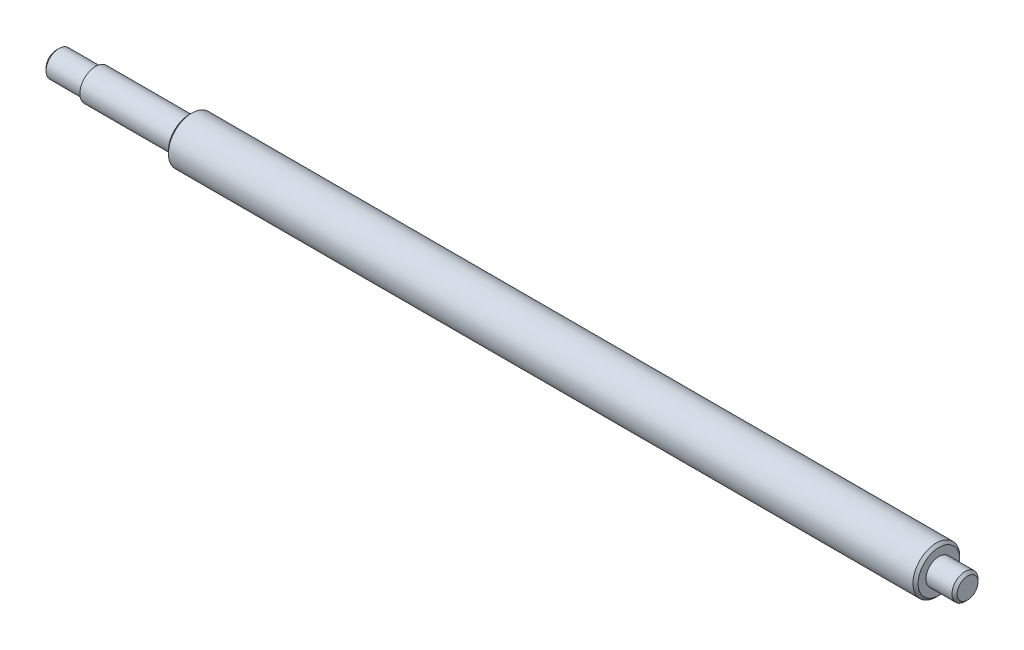
ISO-10303-21;
HEADER;
FILE_DESCRIPTION(('STEP AP214'),'2;1');
FILE_NAME('part.step','',(''),(''),'','','');
FILE_SCHEMA(('AUTOMOTIVE_DESIGN { 1 0 10303 214 1 1 1 1 }'));
ENDSEC;
DATA;
#1=APPLICATION_CONTEXT('core data for automotive mechanical design processes');
#2=APPLICATION_PROTOCOL_DEFINITION('international standard','automotive_design',2000,#1);
#3=PRODUCT_CONTEXT('',#1,'mechanical');
#4=PRODUCT('Part','Part','',(#3));
#5=PRODUCT_RELATED_PRODUCT_CATEGORY('part','',(#4));
#6=PRODUCT_DEFINITION_FORMATION('','',#4);
#7=PRODUCT_DEFINITION_CONTEXT('part definition',#1,'design');
#8=PRODUCT_DEFINITION('design','',#6,#7);
#9=PRODUCT_DEFINITION_SHAPE('','',#8);
#10=(LENGTH_UNIT() NAMED_UNIT(*) SI_UNIT(.MILLI.,.METRE.));
#11=(NAMED_UNIT(*) PLANE_ANGLE_UNIT() SI_UNIT($,.RADIAN.));
#12=(NAMED_UNIT(*) SI_UNIT($,.STERADIAN.) SOLID_ANGLE_UNIT());
#13=UNCERTAINTY_MEASURE_WITH_UNIT(LENGTH_MEASURE(1.E-05),#10,'distance_accuracy_value','');
#14=(GEOMETRIC_REPRESENTATION_CONTEXT(3) GLOBAL_UNCERTAINTY_ASSIGNED_CONTEXT((#13)) GLOBAL_UNIT_ASSIGNED_CONTEXT((#10,
#11,#12)) REPRESENTATION_CONTEXT('',''));
#15=CARTESIAN_POINT('',(0.,0.,0.));
#16=DIRECTION('',(0.,0.,1.));
#17=DIRECTION('',(1.,0.,0.));
#18=AXIS2_PLACEMENT_3D('',#15,#16,#17);
#19=CARTESIAN_POINT('',(-208.466913464529,0.,0.));
#20=DIRECTION('',(1.,0.,0.));
#21=DIRECTION('',(0.,0.,-1.));
#22=AXIS2_PLACEMENT_3D('',#19,#20,#21);
#23=PLANE('',#22);
#24=CARTESIAN_POINT('',(-208.466913464529,0.,0.));
#25=DIRECTION('',(-1.,0.,0.));
#26=DIRECTION('',(0.,0.,1.));
#27=AXIS2_PLACEMENT_3D('',#24,#25,#26);
#28=CIRCLE('',#27,4.);
#29=CARTESIAN_POINT('',(-208.466913464529,0.,4.));
#30=VERTEX_POINT('',#29);
#31=EDGE_CURVE('E10',#30,#30,#28,.T.);
#32=ORIENTED_EDGE('',*,*,#31,.T.);
#33=EDGE_LOOP('',(#32));
#34=FACE_BOUND('',#33,.T.);
#35=ADVANCED_FACE('F30',(#34),#23,.F.);
#36=CARTESIAN_POINT('',(-207.466913464529,0.,0.));
#37=DIRECTION('',(1.,0.,0.));
#38=DIRECTION('',(0.,0.,-1.));
#39=AXIS2_PLACEMENT_3D('',#36,#37,#38);
#40=CONICAL_SURFACE('',#39,5.,0.785398163397448);
#41=ORIENTED_EDGE('',*,*,#31,.F.);
#42=EDGE_LOOP('',(#41));
#43=FACE_BOUND('',#42,.T.);
#44=CARTESIAN_POINT('',(-207.466913464529,0.,0.));
#45=DIRECTION('',(-1.,0.,0.));
#46=DIRECTION('',(0.,0.,1.));
#47=AXIS2_PLACEMENT_3D('',#44,#45,#46);
#48=CIRCLE('',#47,5.);
#49=CARTESIAN_POINT('',(-207.466913464529,0.,5.));
#50=VERTEX_POINT('',#49);
#51=EDGE_CURVE('E36',#50,#50,#48,.T.);
#52=ORIENTED_EDGE('',*,*,#51,.T.);
#53=EDGE_LOOP('',(#52));
#54=FACE_BOUND('',#53,.T.);
#55=ADVANCED_FACE('F86',(#43,#54),#40,.T.);
#56=CARTESIAN_POINT('',(-222.964145739585,0.,0.));
#57=DIRECTION('',(-1.,0.,0.));
#58=DIRECTION('',(0.,0.,1.));
#59=AXIS2_PLACEMENT_3D('',#56,#57,#58);
#60=CYLINDRICAL_SURFACE('',#59,5.);
#61=ORIENTED_EDGE('',*,*,#51,.F.);
#62=EDGE_LOOP('',(#61));
#63=FACE_BOUND('',#62,.T.);
#64=CARTESIAN_POINT('',(-193.466913464529,0.,0.));
#65=DIRECTION('',(-1.,0.,0.));
#66=DIRECTION('',(0.,0.,1.));
#67=AXIS2_PLACEMENT_3D('',#64,#65,#66);
#68=CIRCLE('',#67,5.);
#69=CARTESIAN_POINT('',(-193.466913464529,0.,5.));
#70=VERTEX_POINT('',#69);
#71=EDGE_CURVE('E40',#70,#70,#68,.T.);
#72=ORIENTED_EDGE('',*,*,#71,.T.);
#73=EDGE_LOOP('',(#72));
#74=FACE_BOUND('',#73,.T.);
#75=ADVANCED_FACE('F90',(#63,#74),#60,.T.);
#76=CARTESIAN_POINT('',(-193.466913464529,0.,-5.));
#77=DIRECTION('',(1.,0.,0.));
#78=DIRECTION('',(0.,0.,-1.));
#79=AXIS2_PLACEMENT_3D('',#76,#77,#78);
#80=PLANE('',#79);
#81=ORIENTED_EDGE('',*,*,#71,.F.);
#82=EDGE_LOOP('',(#81));
#83=FACE_BOUND('',#82,.T.);
#84=CARTESIAN_POINT('',(-193.466913464529,0.,0.));
#85=DIRECTION('',(-1.,0.,0.));
#86=DIRECTION('',(0.,0.,1.));
#87=AXIS2_PLACEMENT_3D('',#84,#85,#86);
#88=CIRCLE('',#87,6.);
#89=CARTESIAN_POINT('',(-193.466913464529,0.,6.));
#90=VERTEX_POINT('',#89);
#91=EDGE_CURVE('E44',#90,#90,#88,.T.);
#92=ORIENTED_EDGE('',*,*,#91,.T.);
#93=EDGE_LOOP('',(#92));
#94=FACE_BOUND('',#93,.T.);
#95=ADVANCED_FACE('F95',(#83,#94),#80,.F.);
#96=CARTESIAN_POINT('',(-222.964145739585,0.,0.));
#97=DIRECTION('',(-1.,0.,0.));
#98=DIRECTION('',(0.,0.,1.));
#99=AXIS2_PLACEMENT_3D('',#96,#97,#98);
#100=CYLINDRICAL_SURFACE('',#99,6.);
#101=ORIENTED_EDGE('',*,*,#91,.F.);
#102=EDGE_LOOP('',(#101));
#103=FACE_BOUND('',#102,.T.);
#104=CARTESIAN_POINT('',(-157.466913464529,0.,0.));
#105=DIRECTION('',(-1.,0.,0.));
#106=DIRECTION('',(0.,0.,1.));
#107=AXIS2_PLACEMENT_3D('',#104,#105,#106);
#108=CIRCLE('',#107,6.);
#109=CARTESIAN_POINT('',(-157.466913464529,0.,6.));
#110=VERTEX_POINT('',#109);
#111=EDGE_CURVE('E49',#110,#110,#108,.T.);
#112=ORIENTED_EDGE('',*,*,#111,.T.);
#113=EDGE_LOOP('',(#112));
#114=FACE_BOUND('',#113,.T.);
#115=ADVANCED_FACE('F101',(#103,#114),#100,.T.);
#116=CARTESIAN_POINT('',(-157.466913464529,0.,-6.));
#117=DIRECTION('',(1.,0.,0.));
#118=DIRECTION('',(0.,0.,-1.));
#119=AXIS2_PLACEMENT_3D('',#116,#117,#118);
#120=PLANE('',#119);
#121=ORIENTED_EDGE('',*,*,#111,.F.);
#122=EDGE_LOOP('',(#121));
#123=FACE_BOUND('',#122,.T.);
#124=CARTESIAN_POINT('',(-157.466913464529,0.,0.));
#125=DIRECTION('',(-1.,0.,0.));
#126=DIRECTION('',(0.,0.,1.));
#127=AXIS2_PLACEMENT_3D('',#124,#125,#126);
#128=CIRCLE('',#127,8.);
#129=CARTESIAN_POINT('',(-157.466913464529,0.,8.));
#130=VERTEX_POINT('',#129);
#131=EDGE_CURVE('E52',#130,#130,#128,.T.);
#132=ORIENTED_EDGE('',*,*,#131,.T.);
#133=EDGE_LOOP('',(#132));
#134=FACE_BOUND('',#133,.T.);
#135=ADVANCED_FACE('F105',(#123,#134),#120,.F.);
#136=CARTESIAN_POINT('',(-156.466913464529,0.,0.));
#137=DIRECTION('',(1.,0.,0.));
#138=DIRECTION('',(0.,0.,-1.));
#139=AXIS2_PLACEMENT_3D('',#136,#137,#138);
#140=CONICAL_SURFACE('',#139,9.,0.785398163397447);
#141=ORIENTED_EDGE('',*,*,#131,.F.);
#142=EDGE_LOOP('',(#141));
#143=FACE_BOUND('',#142,.T.);
#144=CARTESIAN_POINT('',(-156.466913464529,0.,0.));
#145=DIRECTION('',(-1.,0.,0.));
#146=DIRECTION('',(0.,0.,1.));
#147=AXIS2_PLACEMENT_3D('',#144,#145,#146);
#148=CIRCLE('',#147,9.);
#149=CARTESIAN_POINT('',(-156.466913464529,0.,9.));
#150=VERTEX_POINT('',#149);
#151=EDGE_CURVE('E55',#150,#150,#148,.T.);
#152=ORIENTED_EDGE('',*,*,#151,.T.);
#153=EDGE_LOOP('',(#152));
#154=FACE_BOUND('',#153,.T.);
#155=ADVANCED_FACE('F109',(#143,#154),#140,.T.);
#156=CARTESIAN_POINT('',(-222.964145739585,0.,0.));
#157=DIRECTION('',(-1.,0.,0.));
#158=DIRECTION('',(0.,0.,1.));
#159=AXIS2_PLACEMENT_3D('',#156,#157,#158);
#160=CYLINDRICAL_SURFACE('',#159,9.);
#161=ORIENTED_EDGE('',*,*,#151,.F.);
#162=EDGE_LOOP('',(#161));
#163=FACE_BOUND('',#162,.T.);
#164=CARTESIAN_POINT('',(129.533086535471,0.,0.));
#165=DIRECTION('',(-1.,0.,0.));
#166=DIRECTION('',(0.,0.,1.));
#167=AXIS2_PLACEMENT_3D('',#164,#165,#166);
#168=CIRCLE('',#167,9.);
#169=CARTESIAN_POINT('',(129.533086535471,0.,9.));
#170=VERTEX_POINT('',#169);
#171=EDGE_CURVE('E58',#170,#170,#168,.T.);
#172=ORIENTED_EDGE('',*,*,#171,.T.);
#173=EDGE_LOOP('',(#172));
#174=FACE_BOUND('',#173,.T.);
#175=ADVANCED_FACE('F113',(#163,#174),#160,.T.);
#176=CARTESIAN_POINT('',(130.533086535471,0.,0.));
#177=DIRECTION('',(-1.,0.,0.));
#178=DIRECTION('',(0.,0.,1.));
#179=AXIS2_PLACEMENT_3D('',#176,#177,#178);
#180=CONICAL_SURFACE('',#179,8.,0.785398163397447);
#181=ORIENTED_EDGE('',*,*,#171,.F.);
#182=EDGE_LOOP('',(#181));
#183=FACE_BOUND('',#182,.T.);
#184=CARTESIAN_POINT('',(130.533086535471,0.,0.));
#185=DIRECTION('',(-1.,0.,0.));
#186=DIRECTION('',(0.,0.,1.));
#187=AXIS2_PLACEMENT_3D('',#184,#185,#186);
#188=CIRCLE('',#187,8.);
#189=CARTESIAN_POINT('',(130.533086535471,0.,8.));
#190=VERTEX_POINT('',#189);
#191=EDGE_CURVE('E61',#190,#190,#188,.T.);
#192=ORIENTED_EDGE('',*,*,#191,.T.);
#193=EDGE_LOOP('',(#192));
#194=FACE_BOUND('',#193,.T.);
#195=ADVANCED_FACE('F117',(#183,#194),#180,.T.);
#196=CARTESIAN_POINT('',(130.533086535471,0.,-8.));
#197=DIRECTION('',(-1.,0.,0.));
#198=DIRECTION('',(0.,0.,1.));
#199=AXIS2_PLACEMENT_3D('',#196,#197,#198);
#200=PLANE('',#199);
#201=ORIENTED_EDGE('',*,*,#191,.F.);
#202=EDGE_LOOP('',(#201));
#203=FACE_BOUND('',#202,.T.);
#204=CARTESIAN_POINT('',(130.533086535471,0.,0.));
#205=DIRECTION('',(-1.,0.,0.));
#206=DIRECTION('',(0.,0.,1.));
#207=AXIS2_PLACEMENT_3D('',#204,#205,#206);
#208=CIRCLE('',#207,5.);
#209=CARTESIAN_POINT('',(130.533086535471,0.,5.));
#210=VERTEX_POINT('',#209);
#211=EDGE_CURVE('E64',#210,#210,#208,.T.);
#212=ORIENTED_EDGE('',*,*,#211,.T.);
#213=EDGE_LOOP('',(#212));
#214=FACE_BOUND('',#213,.T.);
#215=ADVANCED_FACE('F121',(#203,#214),#200,.F.);
#216=CARTESIAN_POINT('',(-222.964145739585,0.,0.));
#217=DIRECTION('',(-1.,0.,0.));
#218=DIRECTION('',(0.,0.,1.));
#219=AXIS2_PLACEMENT_3D('',#216,#217,#218);
#220=CYLINDRICAL_SURFACE('',#219,5.);
#221=ORIENTED_EDGE('',*,*,#211,.F.);
#222=EDGE_LOOP('',(#221));
#223=FACE_BOUND('',#222,.T.);
#224=CARTESIAN_POINT('',(140.533086535471,0.,0.));
#225=DIRECTION('',(-1.,0.,0.));
#226=DIRECTION('',(0.,0.,1.));
#227=AXIS2_PLACEMENT_3D('',#224,#225,#226);
#228=CIRCLE('',#227,5.);
#229=CARTESIAN_POINT('',(140.533086535471,0.,5.));
#230=VERTEX_POINT('',#229);
#231=EDGE_CURVE('E67',#230,#230,#228,.T.);
#232=ORIENTED_EDGE('',*,*,#231,.T.);
#233=EDGE_LOOP('',(#232));
#234=FACE_BOUND('',#233,.T.);
#235=ADVANCED_FACE('F82',(#223,#234),#220,.T.);
#236=CARTESIAN_POINT('',(141.533086535471,0.,0.));
#237=DIRECTION('',(-1.,0.,0.));
#238=DIRECTION('',(0.,0.,1.));
#239=AXIS2_PLACEMENT_3D('',#236,#237,#238);
#240=CONICAL_SURFACE('',#239,4.,0.785398163397448);
#241=ORIENTED_EDGE('',*,*,#231,.F.);
#242=EDGE_LOOP('',(#241));
#243=FACE_BOUND('',#242,.T.);
#244=CARTESIAN_POINT('',(141.533086535471,0.,0.));
#245=DIRECTION('',(-1.,0.,0.));
#246=DIRECTION('',(0.,0.,1.));
#247=AXIS2_PLACEMENT_3D('',#244,#245,#246);
#248=CIRCLE('',#247,4.);
#249=CARTESIAN_POINT('',(141.533086535471,0.,4.));
#250=VERTEX_POINT('',#249);
#251=EDGE_CURVE('E70',#250,#250,#248,.T.);
#252=ORIENTED_EDGE('',*,*,#251,.T.);
#253=EDGE_LOOP('',(#252));
#254=FACE_BOUND('',#253,.T.);
#255=ADVANCED_FACE('F74',(#243,#254),#240,.T.);
#256=CARTESIAN_POINT('',(141.533086535471,0.,-4.));
#257=DIRECTION('',(-1.,0.,0.));
#258=DIRECTION('',(0.,0.,1.));
#259=AXIS2_PLACEMENT_3D('',#256,#257,#258);
#260=PLANE('',#259);
#261=ORIENTED_EDGE('',*,*,#251,.F.);
#262=EDGE_LOOP('',(#261));
#263=FACE_BOUND('',#262,.T.);
#264=ADVANCED_FACE('F76',(#263),#260,.F.);
#265=CLOSED_SHELL('',(#35,#55,#75,#95,#115,#135,#155,#175,#195,#215,#235,#255,#264));
#266=MANIFOLD_SOLID_BREP('B2',#265);
#267=ADVANCED_BREP_SHAPE_REPRESENTATION('',(#18,#266),#14);
#268=SHAPE_DEFINITION_REPRESENTATION(#9,#267);
ENDSEC;
END-ISO-10303-21;
